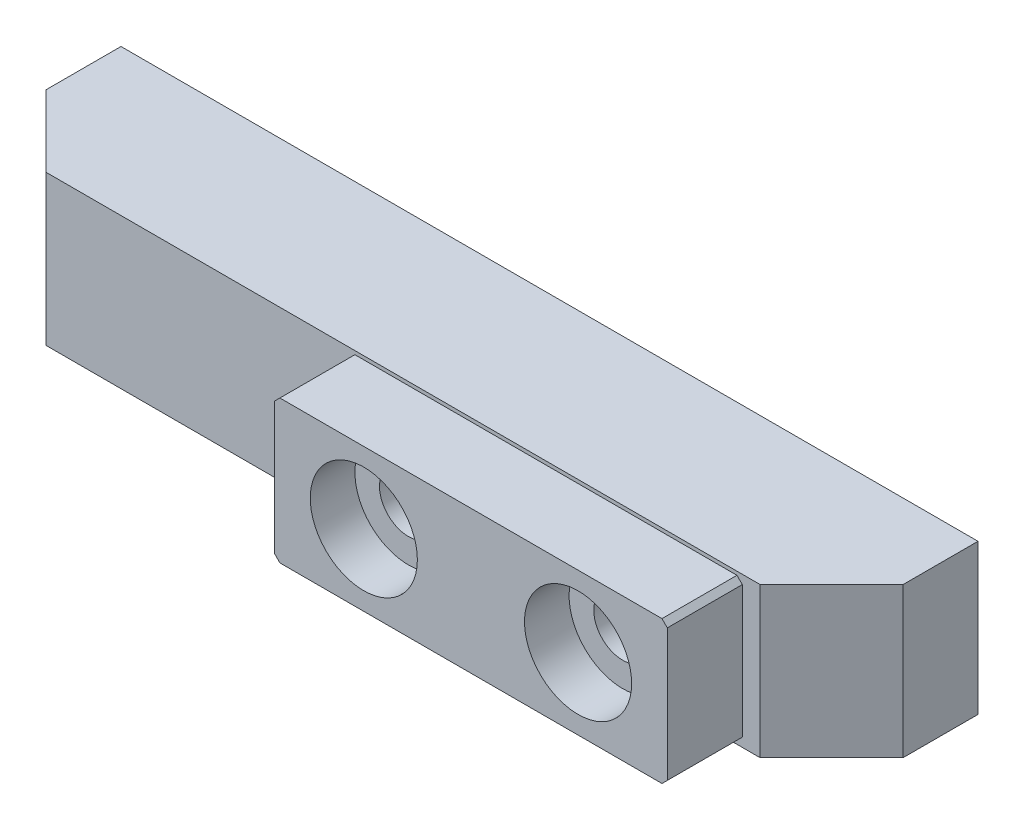
ISO-10303-21;
HEADER;
FILE_DESCRIPTION(('STEP AP214'),'2;1');
FILE_NAME('part.step','',(''),(''),'','','');
FILE_SCHEMA(('AUTOMOTIVE_DESIGN { 1 0 10303 214 1 1 1 1 }'));
ENDSEC;
DATA;
#1=APPLICATION_CONTEXT('core data for automotive mechanical design processes');
#2=APPLICATION_PROTOCOL_DEFINITION('international standard','automotive_design',2000,#1);
#3=PRODUCT_CONTEXT('',#1,'mechanical');
#4=PRODUCT('Part','Part','',(#3));
#5=PRODUCT_RELATED_PRODUCT_CATEGORY('part','',(#4));
#6=PRODUCT_DEFINITION_FORMATION('','',#4);
#7=PRODUCT_DEFINITION_CONTEXT('part definition',#1,'design');
#8=PRODUCT_DEFINITION('design','',#6,#7);
#9=PRODUCT_DEFINITION_SHAPE('','',#8);
#10=(LENGTH_UNIT() NAMED_UNIT(*) SI_UNIT(.MILLI.,.METRE.));
#11=(NAMED_UNIT(*) PLANE_ANGLE_UNIT() SI_UNIT($,.RADIAN.));
#12=(NAMED_UNIT(*) SI_UNIT($,.STERADIAN.) SOLID_ANGLE_UNIT());
#13=UNCERTAINTY_MEASURE_WITH_UNIT(LENGTH_MEASURE(1.E-05),#10,'distance_accuracy_value','');
#14=(GEOMETRIC_REPRESENTATION_CONTEXT(3) GLOBAL_UNCERTAINTY_ASSIGNED_CONTEXT((#13)) GLOBAL_UNIT_ASSIGNED_CONTEXT((#10,
#11,#12)) REPRESENTATION_CONTEXT('',''));
#15=CARTESIAN_POINT('',(0.,0.,0.));
#16=DIRECTION('',(0.,0.,1.));
#17=DIRECTION('',(1.,0.,0.));
#18=AXIS2_PLACEMENT_3D('',#15,#16,#17);
#19=CARTESIAN_POINT('',(3.,0.,0.));
#20=DIRECTION('',(0.,0.,1.));
#21=DIRECTION('',(1.,0.,0.));
#22=AXIS2_PLACEMENT_3D('',#19,#20,#21);
#23=PLANE('',#22);
#24=DIRECTION('',(-1.,0.,0.));
#25=VECTOR('',#24,1.);
#26=CARTESIAN_POINT('',(27.,4.2,0.));
#27=LINE('',#26,#25);
#28=CARTESIAN_POINT('',(27.,4.2,0.));
#29=VERTEX_POINT('',#28);
#30=CARTESIAN_POINT('',(-21.,4.2,0.));
#31=VERTEX_POINT('',#30);
#32=EDGE_CURVE('E295',#29,#31,#27,.T.);
#33=ORIENTED_EDGE('',*,*,#32,.F.);
#34=DIRECTION('',(0.,1.,0.));
#35=VECTOR('',#34,1.);
#36=CARTESIAN_POINT('',(27.,-4.2,0.));
#37=LINE('',#36,#35);
#38=CARTESIAN_POINT('',(27.,-4.2,0.));
#39=VERTEX_POINT('',#38);
#40=EDGE_CURVE('E240',#39,#29,#37,.T.);
#41=ORIENTED_EDGE('',*,*,#40,.F.);
#42=DIRECTION('',(1.,0.,0.));
#43=VECTOR('',#42,1.);
#44=CARTESIAN_POINT('',(-21.,-4.2,0.));
#45=LINE('',#44,#43);
#46=CARTESIAN_POINT('',(-21.,-4.2,0.));
#47=VERTEX_POINT('',#46);
#48=EDGE_CURVE('E233',#47,#39,#45,.T.);
#49=ORIENTED_EDGE('',*,*,#48,.F.);
#50=DIRECTION('',(0.,-1.,0.));
#51=VECTOR('',#50,1.);
#52=CARTESIAN_POINT('',(-21.,4.2,0.));
#53=LINE('',#52,#51);
#54=EDGE_CURVE('E11',#31,#47,#53,.T.);
#55=ORIENTED_EDGE('',*,*,#54,.F.);
#56=EDGE_LOOP('',(#33,#41,#49,#55));
#57=FACE_BOUND('',#56,.T.);
#58=ADVANCED_FACE('F16',(#57),#23,.F.);
#59=CARTESIAN_POINT('',(-21.,-4.2,0.));
#60=DIRECTION('',(-1.,0.,0.));
#61=DIRECTION('',(0.,0.,1.));
#62=AXIS2_PLACEMENT_3D('',#59,#60,#61);
#63=PLANE('',#62);
#64=DIRECTION('',(0.,-1.,0.));
#65=VECTOR('',#64,1.);
#66=CARTESIAN_POINT('',(-21.,4.2,4.2));
#67=LINE('',#66,#65);
#68=CARTESIAN_POINT('',(-21.,4.2,4.2));
#69=VERTEX_POINT('',#68);
#70=CARTESIAN_POINT('',(-21.,-4.2,4.2));
#71=VERTEX_POINT('',#70);
#72=EDGE_CURVE('E260',#69,#71,#67,.T.);
#73=ORIENTED_EDGE('',*,*,#72,.F.);
#74=DIRECTION('',(0.,0.,1.));
#75=VECTOR('',#74,1.);
#76=CARTESIAN_POINT('',(-21.,4.2,0.));
#77=LINE('',#76,#75);
#78=EDGE_CURVE('E244',#31,#69,#77,.T.);
#79=ORIENTED_EDGE('',*,*,#78,.F.);
#80=ORIENTED_EDGE('',*,*,#54,.T.);
#81=DIRECTION('',(0.,0.,1.));
#82=VECTOR('',#81,1.);
#83=CARTESIAN_POINT('',(-21.,-4.2,0.));
#84=LINE('',#83,#82);
#85=EDGE_CURVE('E227',#47,#71,#84,.T.);
#86=ORIENTED_EDGE('',*,*,#85,.T.);
#87=EDGE_LOOP('',(#73,#79,#80,#86));
#88=FACE_BOUND('',#87,.T.);
#89=ADVANCED_FACE('F449',(#88),#63,.T.);
#90=CARTESIAN_POINT('',(0.,4.,8.2));
#91=DIRECTION('',(0.,1.,0.));
#92=DIRECTION('',(1.,0.,0.));
#93=AXIS2_PLACEMENT_3D('',#90,#91,#92);
#94=PLANE('',#93);
#95=DIRECTION('',(0.,0.,-1.));
#96=VECTOR('',#95,1.);
#97=CARTESIAN_POINT('',(0.3,4.,12.4));
#98=LINE('',#97,#96);
#99=CARTESIAN_POINT('',(0.3,4.,12.4));
#100=VERTEX_POINT('',#99);
#101=CARTESIAN_POINT('',(0.3,4.,8.2));
#102=VERTEX_POINT('',#101);
#103=EDGE_CURVE('E22',#100,#102,#98,.T.);
#104=ORIENTED_EDGE('',*,*,#103,.F.);
#105=DIRECTION('',(1.,0.,0.));
#106=VECTOR('',#105,1.);
#107=CARTESIAN_POINT('',(0.3,4.,12.4));
#108=LINE('',#107,#106);
#109=CARTESIAN_POINT('',(21.7,4.,12.4));
#110=VERTEX_POINT('',#109);
#111=EDGE_CURVE('E297',#100,#110,#108,.T.);
#112=ORIENTED_EDGE('',*,*,#111,.T.);
#113=DIRECTION('',(0.,0.,1.));
#114=VECTOR('',#113,1.);
#115=CARTESIAN_POINT('',(21.7,4.,8.2));
#116=LINE('',#115,#114);
#117=CARTESIAN_POINT('',(21.7,4.,8.2));
#118=VERTEX_POINT('',#117);
#119=EDGE_CURVE('E263',#118,#110,#116,.T.);
#120=ORIENTED_EDGE('',*,*,#119,.F.);
#121=DIRECTION('',(1.,0.,0.));
#122=VECTOR('',#121,1.);
#123=CARTESIAN_POINT('',(0.3,4.,8.2));
#124=LINE('',#123,#122);
#125=EDGE_CURVE('E197',#102,#118,#124,.T.);
#126=ORIENTED_EDGE('',*,*,#125,.F.);
#127=EDGE_LOOP('',(#104,#112,#120,#126));
#128=FACE_BOUND('',#127,.T.);
#129=ADVANCED_FACE('F443',(#128),#94,.T.);
#130=CARTESIAN_POINT('',(22.,-4.,8.2));
#131=DIRECTION('',(0.,-1.,0.));
#132=DIRECTION('',(0.,0.,-1.));
#133=AXIS2_PLACEMENT_3D('',#130,#131,#132);
#134=PLANE('',#133);
#135=DIRECTION('',(0.,0.,1.));
#136=VECTOR('',#135,1.);
#137=CARTESIAN_POINT('',(0.3,-4.,8.2));
#138=LINE('',#137,#136);
#139=CARTESIAN_POINT('',(0.3,-4.,8.2));
#140=VERTEX_POINT('',#139);
#141=CARTESIAN_POINT('',(0.3,-4.,12.4));
#142=VERTEX_POINT('',#141);
#143=EDGE_CURVE('E264',#140,#142,#138,.T.);
#144=ORIENTED_EDGE('',*,*,#143,.F.);
#145=DIRECTION('',(-1.,0.,0.));
#146=VECTOR('',#145,1.);
#147=CARTESIAN_POINT('',(21.7,-4.,8.2));
#148=LINE('',#147,#146);
#149=CARTESIAN_POINT('',(21.7,-4.,8.2));
#150=VERTEX_POINT('',#149);
#151=EDGE_CURVE('E217',#150,#140,#148,.T.);
#152=ORIENTED_EDGE('',*,*,#151,.F.);
#153=DIRECTION('',(0.,0.,-1.));
#154=VECTOR('',#153,1.);
#155=CARTESIAN_POINT('',(21.7,-4.,12.4));
#156=LINE('',#155,#154);
#157=CARTESIAN_POINT('',(21.7,-4.,12.4));
#158=VERTEX_POINT('',#157);
#159=EDGE_CURVE('E191',#158,#150,#156,.T.);
#160=ORIENTED_EDGE('',*,*,#159,.F.);
#161=DIRECTION('',(-1.,0.,0.));
#162=VECTOR('',#161,1.);
#163=CARTESIAN_POINT('',(21.7,-4.,12.4));
#164=LINE('',#163,#162);
#165=EDGE_CURVE('E318',#158,#142,#164,.T.);
#166=ORIENTED_EDGE('',*,*,#165,.T.);
#167=EDGE_LOOP('',(#144,#152,#160,#166));
#168=FACE_BOUND('',#167,.T.);
#169=ADVANCED_FACE('F448',(#168),#134,.T.);
#170=CARTESIAN_POINT('',(3.379,1.621,4.9));
#171=CARTESIAN_POINT('',(3.379,-1.621,4.9));
#172=CARTESIAN_POINT('',(6.621,1.621,4.9));
#173=CARTESIAN_POINT('',(6.621,-1.621,4.9));
#174=(BOUNDED_SURFACE() B_SPLINE_SURFACE(1,1,((#170,#171),(#172,#173)),.UNSPECIFIED.,.F.,.F.,
.F.) B_SPLINE_SURFACE_WITH_KNOTS((2,2),(2,2),(0.,3.242),(0.,3.242),
.UNSPECIFIED.) GEOMETRIC_REPRESENTATION_ITEM() RATIONAL_B_SPLINE_SURFACE(((1.,1.),(1.,1.))) REPRESENTATION_ITEM('') SURFACE());
#175=CARTESIAN_POINT('',(5.,0.,4.9));
#176=DIRECTION('',(0.,0.,1.));
#177=DIRECTION('',(1.,0.,0.));
#178=AXIS2_PLACEMENT_3D('',#175,#176,#177);
#179=CIRCLE('',#178,1.621);
#180=CARTESIAN_POINT('',(6.621,0.,4.9));
#181=VERTEX_POINT('',#180);
#182=EDGE_CURVE('E29',#181,#181,#179,.T.);
#183=ORIENTED_EDGE('',*,*,#182,.T.);
#184=EDGE_LOOP('',(#183));
#185=FACE_BOUND('',#184,.T.);
#186=ADVANCED_FACE('F18',(#185),#174,.F.);
#187=CARTESIAN_POINT('',(3.379,0.,9.9));
#188=CARTESIAN_POINT('',(3.379,-1.621,9.90000000000001));
#189=CARTESIAN_POINT('',(5.,-1.621,9.9));
#190=CARTESIAN_POINT('',(6.62099999999999,-1.621,9.90000000000001));
#191=CARTESIAN_POINT('',(6.621,0.,9.9));
#192=CARTESIAN_POINT('',(6.62099999999999,1.621,9.90000000000001));
#193=CARTESIAN_POINT('',(5.,1.621,9.9));
#194=CARTESIAN_POINT('',(3.379,1.621,9.90000000000001));
#195=CARTESIAN_POINT('',(3.379,0.,9.9));
#196=CARTESIAN_POINT('',(3.379,0.,4.9));
#197=CARTESIAN_POINT('',(3.379,-1.621,4.9));
#198=CARTESIAN_POINT('',(5.,-1.621,4.9));
#199=CARTESIAN_POINT('',(6.62099999999999,-1.621,4.9));
#200=CARTESIAN_POINT('',(6.621,0.,4.9));
#201=CARTESIAN_POINT('',(6.62099999999999,1.621,4.9));
#202=CARTESIAN_POINT('',(5.,1.621,4.9));
#203=CARTESIAN_POINT('',(3.379,1.621,4.9));
#204=CARTESIAN_POINT('',(3.379,0.,4.9));
#205=(BOUNDED_SURFACE() B_SPLINE_SURFACE(1,2,((#187,#188,#189,#190,#191,#192,#193,#194,#195),
(#196,#197,#198,#199,#200,#201,#202,#203,#204)),.UNSPECIFIED.,.F.,.T.,
.F.) B_SPLINE_SURFACE_WITH_KNOTS((2,2),(3,2,2,2,3),(-0.771128932757557,2.31338679827267),(0.,
2.54626084573453,5.09252169146906,7.63878253720358,10.1850433829381),
.UNSPECIFIED.) GEOMETRIC_REPRESENTATION_ITEM() RATIONAL_B_SPLINE_SURFACE(((1.,0.707106781186548,
1.,0.707106781186548,1.,0.707106781186548,1.,0.707106781186548,1.),(1.,0.707106781186548,1.,
0.707106781186548,1.,0.707106781186548,1.,0.707106781186548,1.))) REPRESENTATION_ITEM('') SURFACE());
#206=CARTESIAN_POINT('',(5.,0.,9.9));
#207=DIRECTION('',(0.,0.,1.));
#208=DIRECTION('',(1.,0.,0.));
#209=AXIS2_PLACEMENT_3D('',#206,#207,#208);
#210=CIRCLE('',#209,1.621);
#211=CARTESIAN_POINT('',(3.379,0.,9.9));
#212=VERTEX_POINT('',#211);
#213=EDGE_CURVE('E218',#212,#212,#210,.T.);
#214=ORIENTED_EDGE('',*,*,#182,.F.);
#215=EDGE_LOOP('',(#214));
#216=FACE_BOUND('',#215,.T.);
#217=ORIENTED_EDGE('',*,*,#213,.T.);
#218=EDGE_LOOP('',(#217));
#219=FACE_BOUND('',#218,.T.);
#220=ADVANCED_FACE('F513',(#216,#219),#205,.F.);
#221=CARTESIAN_POINT('',(2.,0.,12.4));
#222=CARTESIAN_POINT('',(2.,-3.,12.4));
#223=CARTESIAN_POINT('',(5.,-3.,12.4));
#224=CARTESIAN_POINT('',(7.99999999999999,-3.,12.4));
#225=CARTESIAN_POINT('',(8.,0.,12.4));
#226=CARTESIAN_POINT('',(7.99999999999999,3.,12.4));
#227=CARTESIAN_POINT('',(5.,3.,12.4));
#228=CARTESIAN_POINT('',(2.,3.,12.4));
#229=CARTESIAN_POINT('',(2.,0.,12.4));
#230=CARTESIAN_POINT('',(2.,0.,9.9));
#231=CARTESIAN_POINT('',(2.,-3.,9.90000000000001));
#232=CARTESIAN_POINT('',(5.,-3.,9.9));
#233=CARTESIAN_POINT('',(7.99999999999999,-3.,9.90000000000001));
#234=CARTESIAN_POINT('',(8.,0.,9.9));
#235=CARTESIAN_POINT('',(7.99999999999999,3.,9.90000000000001));
#236=CARTESIAN_POINT('',(5.,3.,9.9));
#237=CARTESIAN_POINT('',(2.,3.,9.90000000000001));
#238=CARTESIAN_POINT('',(2.,0.,9.9));
#239=(BOUNDED_SURFACE() B_SPLINE_SURFACE(1,2,((#221,#222,#223,#224,#225,#226,#227,#228,#229),
(#230,#231,#232,#233,#234,#235,#236,#237,#238)),.UNSPECIFIED.,.F.,.T.,
.F.) B_SPLINE_SURFACE_WITH_KNOTS((2,2),(3,2,2,2,3),(-0.416666666666667,0.416666666666667),(0.,
4.71238898038469,9.42477796076938,14.1371669411541,18.8495559215388),
.UNSPECIFIED.) GEOMETRIC_REPRESENTATION_ITEM() RATIONAL_B_SPLINE_SURFACE(((1.,0.707106781186548,
1.,0.707106781186548,1.,0.707106781186548,1.,0.707106781186548,1.),(1.,0.707106781186548,1.,
0.707106781186548,1.,0.707106781186548,1.,0.707106781186548,1.))) REPRESENTATION_ITEM('') SURFACE());
#240=CARTESIAN_POINT('',(5.,0.,9.9));
#241=DIRECTION('',(0.,0.,1.));
#242=DIRECTION('',(1.,0.,0.));
#243=AXIS2_PLACEMENT_3D('',#240,#241,#242);
#244=CIRCLE('',#243,3.);
#245=CARTESIAN_POINT('',(8.,0.,9.9));
#246=VERTEX_POINT('',#245);
#247=EDGE_CURVE('E189',#246,#246,#244,.T.);
#248=CARTESIAN_POINT('',(5.,0.,12.4));
#249=DIRECTION('',(0.,0.,-1.));
#250=DIRECTION('',(1.,0.,0.));
#251=AXIS2_PLACEMENT_3D('',#248,#249,#250);
#252=CIRCLE('',#251,3.);
#253=CARTESIAN_POINT('',(8.,0.,12.4));
#254=VERTEX_POINT('',#253);
#255=EDGE_CURVE('E276',#254,#254,#252,.T.);
#256=ORIENTED_EDGE('',*,*,#247,.F.);
#257=EDGE_LOOP('',(#256));
#258=FACE_BOUND('',#257,.T.);
#259=ORIENTED_EDGE('',*,*,#255,.F.);
#260=EDGE_LOOP('',(#259));
#261=FACE_BOUND('',#260,.T.);
#262=ADVANCED_FACE('F436',(#258,#261),#239,.F.);
#263=CARTESIAN_POINT('',(2.,3.,9.9));
#264=CARTESIAN_POINT('',(2.,-3.,9.9));
#265=CARTESIAN_POINT('',(8.,3.,9.9));
#266=CARTESIAN_POINT('',(8.,-3.,9.9));
#267=(BOUNDED_SURFACE() B_SPLINE_SURFACE(1,1,((#263,#264),(#265,#266)),.UNSPECIFIED.,.F.,.F.,
.F.) B_SPLINE_SURFACE_WITH_KNOTS((2,2),(2,2),(0.,6.),(0.,6.),
.UNSPECIFIED.) GEOMETRIC_REPRESENTATION_ITEM() RATIONAL_B_SPLINE_SURFACE(((1.,1.),(1.,1.))) REPRESENTATION_ITEM('') SURFACE());
#268=ORIENTED_EDGE('',*,*,#213,.F.);
#269=EDGE_LOOP('',(#268));
#270=FACE_BOUND('',#269,.T.);
#271=ORIENTED_EDGE('',*,*,#247,.T.);
#272=EDGE_LOOP('',(#271));
#273=FACE_BOUND('',#272,.T.);
#274=ADVANCED_FACE('F430',(#270,#273),#267,.F.);
#275=CARTESIAN_POINT('',(15.379,1.621,4.9));
#276=CARTESIAN_POINT('',(15.379,-1.621,4.9));
#277=CARTESIAN_POINT('',(18.621,1.621,4.9));
#278=CARTESIAN_POINT('',(18.621,-1.621,4.9));
#279=(BOUNDED_SURFACE() B_SPLINE_SURFACE(1,1,((#275,#276),(#277,#278)),.UNSPECIFIED.,.F.,.F.,
.F.) B_SPLINE_SURFACE_WITH_KNOTS((2,2),(2,2),(0.,3.242),(0.,3.242),
.UNSPECIFIED.) GEOMETRIC_REPRESENTATION_ITEM() RATIONAL_B_SPLINE_SURFACE(((1.,1.),(1.,1.))) REPRESENTATION_ITEM('') SURFACE());
#280=CARTESIAN_POINT('',(17.,0.,4.9));
#281=DIRECTION('',(0.,0.,1.));
#282=DIRECTION('',(1.,0.,0.));
#283=AXIS2_PLACEMENT_3D('',#280,#281,#282);
#284=CIRCLE('',#283,1.621);
#285=CARTESIAN_POINT('',(18.621,0.,4.9));
#286=VERTEX_POINT('',#285);
#287=EDGE_CURVE('E181',#286,#286,#284,.T.);
#288=ORIENTED_EDGE('',*,*,#287,.T.);
#289=EDGE_LOOP('',(#288));
#290=FACE_BOUND('',#289,.T.);
#291=ADVANCED_FACE('F435',(#290),#279,.F.);
#292=CARTESIAN_POINT('',(15.379,0.,9.9));
#293=CARTESIAN_POINT('',(15.379,-1.621,9.90000000000001));
#294=CARTESIAN_POINT('',(17.,-1.621,9.9));
#295=CARTESIAN_POINT('',(18.621,-1.621,9.90000000000001));
#296=CARTESIAN_POINT('',(18.621,0.,9.9));
#297=CARTESIAN_POINT('',(18.621,1.621,9.90000000000001));
#298=CARTESIAN_POINT('',(17.,1.621,9.9));
#299=CARTESIAN_POINT('',(15.379,1.621,9.90000000000001));
#300=CARTESIAN_POINT('',(15.379,0.,9.9));
#301=CARTESIAN_POINT('',(15.379,0.,4.9));
#302=CARTESIAN_POINT('',(15.379,-1.621,4.9));
#303=CARTESIAN_POINT('',(17.,-1.621,4.9));
#304=CARTESIAN_POINT('',(18.621,-1.621,4.9));
#305=CARTESIAN_POINT('',(18.621,0.,4.9));
#306=CARTESIAN_POINT('',(18.621,1.621,4.9));
#307=CARTESIAN_POINT('',(17.,1.621,4.9));
#308=CARTESIAN_POINT('',(15.379,1.621,4.9));
#309=CARTESIAN_POINT('',(15.379,0.,4.9));
#310=(BOUNDED_SURFACE() B_SPLINE_SURFACE(1,2,((#292,#293,#294,#295,#296,#297,#298,#299,#300),
(#301,#302,#303,#304,#305,#306,#307,#308,#309)),.UNSPECIFIED.,.F.,.T.,
.F.) B_SPLINE_SURFACE_WITH_KNOTS((2,2),(3,2,2,2,3),(-0.771128932757557,2.31338679827267),(0.,
2.54626084573453,5.09252169146906,7.63878253720358,10.1850433829381),
.UNSPECIFIED.) GEOMETRIC_REPRESENTATION_ITEM() RATIONAL_B_SPLINE_SURFACE(((1.,0.707106781186548,
1.,0.707106781186548,1.,0.707106781186548,1.,0.707106781186548,1.),(1.,0.707106781186548,1.,
0.707106781186548,1.,0.707106781186548,1.,0.707106781186548,1.))) REPRESENTATION_ITEM('') SURFACE());
#311=CARTESIAN_POINT('',(17.,0.,9.9));
#312=DIRECTION('',(0.,0.,1.));
#313=DIRECTION('',(1.,0.,0.));
#314=AXIS2_PLACEMENT_3D('',#311,#312,#313);
#315=CIRCLE('',#314,1.621);
#316=CARTESIAN_POINT('',(15.379,0.,9.9));
#317=VERTEX_POINT('',#316);
#318=EDGE_CURVE('E177',#317,#317,#315,.T.);
#319=ORIENTED_EDGE('',*,*,#287,.F.);
#320=EDGE_LOOP('',(#319));
#321=FACE_BOUND('',#320,.T.);
#322=ORIENTED_EDGE('',*,*,#318,.T.);
#323=EDGE_LOOP('',(#322));
#324=FACE_BOUND('',#323,.T.);
#325=ADVANCED_FACE('F178',(#321,#324),#310,.F.);
#326=CARTESIAN_POINT('',(14.,0.,12.4));
#327=CARTESIAN_POINT('',(14.,-3.,12.4));
#328=CARTESIAN_POINT('',(17.,-3.,12.4));
#329=CARTESIAN_POINT('',(20.,-3.,12.4));
#330=CARTESIAN_POINT('',(20.,0.,12.4));
#331=CARTESIAN_POINT('',(20.,3.,12.4));
#332=CARTESIAN_POINT('',(17.,3.,12.4));
#333=CARTESIAN_POINT('',(14.,3.,12.4));
#334=CARTESIAN_POINT('',(14.,0.,12.4));
#335=CARTESIAN_POINT('',(14.,0.,9.9));
#336=CARTESIAN_POINT('',(14.,-3.,9.90000000000001));
#337=CARTESIAN_POINT('',(17.,-3.,9.9));
#338=CARTESIAN_POINT('',(20.,-3.,9.90000000000001));
#339=CARTESIAN_POINT('',(20.,0.,9.9));
#340=CARTESIAN_POINT('',(20.,3.,9.90000000000001));
#341=CARTESIAN_POINT('',(17.,3.,9.9));
#342=CARTESIAN_POINT('',(14.,3.,9.90000000000001));
#343=CARTESIAN_POINT('',(14.,0.,9.9));
#344=(BOUNDED_SURFACE() B_SPLINE_SURFACE(1,2,((#326,#327,#328,#329,#330,#331,#332,#333,#334),
(#335,#336,#337,#338,#339,#340,#341,#342,#343)),.UNSPECIFIED.,.F.,.T.,
.F.) B_SPLINE_SURFACE_WITH_KNOTS((2,2),(3,2,2,2,3),(-0.416666666666667,0.416666666666667),(0.,
4.71238898038469,9.42477796076938,14.1371669411541,18.8495559215388),
.UNSPECIFIED.) GEOMETRIC_REPRESENTATION_ITEM() RATIONAL_B_SPLINE_SURFACE(((1.,0.707106781186548,
1.,0.707106781186548,1.,0.707106781186548,1.,0.707106781186548,1.),(1.,0.707106781186548,1.,
0.707106781186548,1.,0.707106781186548,1.,0.707106781186548,1.))) REPRESENTATION_ITEM('') SURFACE());
#345=CARTESIAN_POINT('',(17.,0.,9.9));
#346=DIRECTION('',(0.,0.,1.));
#347=DIRECTION('',(1.,0.,0.));
#348=AXIS2_PLACEMENT_3D('',#345,#346,#347);
#349=CIRCLE('',#348,3.);
#350=CARTESIAN_POINT('',(20.,0.,9.9));
#351=VERTEX_POINT('',#350);
#352=EDGE_CURVE('E182',#351,#351,#349,.T.);
#353=CARTESIAN_POINT('',(17.,0.,12.4));
#354=DIRECTION('',(0.,0.,-1.));
#355=DIRECTION('',(1.,0.,0.));
#356=AXIS2_PLACEMENT_3D('',#353,#354,#355);
#357=CIRCLE('',#356,3.);
#358=CARTESIAN_POINT('',(20.,0.,12.4));
#359=VERTEX_POINT('',#358);
#360=EDGE_CURVE('E301',#359,#359,#357,.T.);
#361=ORIENTED_EDGE('',*,*,#352,.F.);
#362=EDGE_LOOP('',(#361));
#363=FACE_BOUND('',#362,.T.);
#364=ORIENTED_EDGE('',*,*,#360,.F.);
#365=EDGE_LOOP('',(#364));
#366=FACE_BOUND('',#365,.T.);
#367=ADVANCED_FACE('F602',(#363,#366),#344,.F.);
#368=CARTESIAN_POINT('',(14.,3.,9.9));
#369=CARTESIAN_POINT('',(14.,-3.,9.9));
#370=CARTESIAN_POINT('',(20.,3.,9.9));
#371=CARTESIAN_POINT('',(20.,-3.,9.9));
#372=(BOUNDED_SURFACE() B_SPLINE_SURFACE(1,1,((#368,#369),(#370,#371)),.UNSPECIFIED.,.F.,.F.,
.F.) B_SPLINE_SURFACE_WITH_KNOTS((2,2),(2,2),(0.,6.),(0.,6.),
.UNSPECIFIED.) GEOMETRIC_REPRESENTATION_ITEM() RATIONAL_B_SPLINE_SURFACE(((1.,1.),(1.,1.))) REPRESENTATION_ITEM('') SURFACE());
#373=ORIENTED_EDGE('',*,*,#318,.F.);
#374=EDGE_LOOP('',(#373));
#375=FACE_BOUND('',#374,.T.);
#376=ORIENTED_EDGE('',*,*,#352,.T.);
#377=EDGE_LOOP('',(#376));
#378=FACE_BOUND('',#377,.T.);
#379=ADVANCED_FACE('F585',(#375,#378),#372,.F.);
#380=CARTESIAN_POINT('',(21.85,-3.85,8.2));
#381=DIRECTION('',(0.70710678118655,-0.707106781186545,0.));
#382=DIRECTION('',(0.,0.,-1.));
#383=AXIS2_PLACEMENT_3D('',#380,#381,#382);
#384=PLANE('',#383);
#385=DIRECTION('',(-0.707106781186543,-0.707106781186552,0.));
#386=VECTOR('',#385,1.);
#387=CARTESIAN_POINT('',(22.,-3.7,12.4));
#388=LINE('',#387,#386);
#389=CARTESIAN_POINT('',(22.,-3.7,12.4));
#390=VERTEX_POINT('',#389);
#391=EDGE_CURVE('E195',#390,#158,#388,.T.);
#392=ORIENTED_EDGE('',*,*,#391,.T.);
#393=ORIENTED_EDGE('',*,*,#159,.T.);
#394=DIRECTION('',(0.707106781186544,0.707106781186551,0.));
#395=VECTOR('',#394,1.);
#396=CARTESIAN_POINT('',(22.,-3.7,8.2));
#397=LINE('',#396,#395);
#398=CARTESIAN_POINT('',(22.,-3.7,8.2));
#399=VERTEX_POINT('',#398);
#400=EDGE_CURVE('E212',#150,#399,#397,.T.);
#401=ORIENTED_EDGE('',*,*,#400,.T.);
#402=DIRECTION('',(0.,0.,1.));
#403=VECTOR('',#402,1.);
#404=CARTESIAN_POINT('',(22.,-3.7,8.2));
#405=LINE('',#404,#403);
#406=EDGE_CURVE('E273',#399,#390,#405,.T.);
#407=ORIENTED_EDGE('',*,*,#406,.T.);
#408=EDGE_LOOP('',(#392,#393,#401,#407));
#409=FACE_BOUND('',#408,.T.);
#410=ADVANCED_FACE('F562',(#409),#384,.T.);
#411=CARTESIAN_POINT('',(22.,4.,8.2));
#412=DIRECTION('',(1.,0.,0.));
#413=DIRECTION('',(0.,1.,0.));
#414=AXIS2_PLACEMENT_3D('',#411,#412,#413);
#415=PLANE('',#414);
#416=DIRECTION('',(0.,0.,-1.));
#417=VECTOR('',#416,1.);
#418=CARTESIAN_POINT('',(22.,3.7,12.4));
#419=LINE('',#418,#417);
#420=CARTESIAN_POINT('',(22.,3.7,12.4));
#421=VERTEX_POINT('',#420);
#422=CARTESIAN_POINT('',(22.,3.7,8.2));
#423=VERTEX_POINT('',#422);
#424=EDGE_CURVE('E261',#421,#423,#419,.T.);
#425=ORIENTED_EDGE('',*,*,#424,.F.);
#426=DIRECTION('',(0.,-1.,0.));
#427=VECTOR('',#426,1.);
#428=CARTESIAN_POINT('',(22.,3.7,12.4));
#429=LINE('',#428,#427);
#430=EDGE_CURVE('E331',#421,#390,#429,.T.);
#431=ORIENTED_EDGE('',*,*,#430,.T.);
#432=ORIENTED_EDGE('',*,*,#406,.F.);
#433=DIRECTION('',(0.,-1.,0.));
#434=VECTOR('',#433,1.);
#435=CARTESIAN_POINT('',(22.,3.7,8.2));
#436=LINE('',#435,#434);
#437=EDGE_CURVE('E208',#423,#399,#436,.T.);
#438=ORIENTED_EDGE('',*,*,#437,.F.);
#439=EDGE_LOOP('',(#425,#431,#432,#438));
#440=FACE_BOUND('',#439,.T.);
#441=ADVANCED_FACE('F494',(#440),#415,.T.);
#442=CARTESIAN_POINT('',(21.85,3.85,8.2));
#443=DIRECTION('',(0.70710678118655,0.707106781186545,0.));
#444=DIRECTION('',(0.,0.,-1.));
#445=AXIS2_PLACEMENT_3D('',#442,#443,#444);
#446=PLANE('',#445);
#447=DIRECTION('',(0.707106781186543,-0.707106781186552,0.));
#448=VECTOR('',#447,1.);
#449=CARTESIAN_POINT('',(21.7,4.,12.4));
#450=LINE('',#449,#448);
#451=EDGE_CURVE('E302',#110,#421,#450,.T.);
#452=ORIENTED_EDGE('',*,*,#451,.T.);
#453=ORIENTED_EDGE('',*,*,#424,.T.);
#454=DIRECTION('',(-0.707106781186543,0.707106781186552,0.));
#455=VECTOR('',#454,1.);
#456=CARTESIAN_POINT('',(21.7,4.,8.2));
#457=LINE('',#456,#455);
#458=EDGE_CURVE('E201',#423,#118,#457,.T.);
#459=ORIENTED_EDGE('',*,*,#458,.T.);
#460=ORIENTED_EDGE('',*,*,#119,.T.);
#461=EDGE_LOOP('',(#452,#453,#459,#460));
#462=FACE_BOUND('',#461,.T.);
#463=ADVANCED_FACE('F488',(#462),#446,.T.);
#464=CARTESIAN_POINT('',(0.15,-3.85,8.2));
#465=DIRECTION('',(-0.707106781186546,-0.707106781186549,0.));
#466=DIRECTION('',(-0.707106781186549,0.707106781186546,0.));
#467=AXIS2_PLACEMENT_3D('',#464,#465,#466);
#468=PLANE('',#467);
#469=DIRECTION('',(-0.707106781186549,0.707106781186547,0.));
#470=VECTOR('',#469,1.);
#471=CARTESIAN_POINT('',(0.3,-4.,12.4));
#472=LINE('',#471,#470);
#473=CARTESIAN_POINT('',(0.,-3.7,12.4));
#474=VERTEX_POINT('',#473);
#475=EDGE_CURVE('E269',#142,#474,#472,.T.);
#476=ORIENTED_EDGE('',*,*,#475,.T.);
#477=DIRECTION('',(0.,0.,-1.));
#478=VECTOR('',#477,1.);
#479=CARTESIAN_POINT('',(0.,-3.7,12.4));
#480=LINE('',#479,#478);
#481=CARTESIAN_POINT('',(0.,-3.7,8.2));
#482=VERTEX_POINT('',#481);
#483=EDGE_CURVE('E274',#474,#482,#480,.T.);
#484=ORIENTED_EDGE('',*,*,#483,.T.);
#485=DIRECTION('',(0.707106781186549,-0.707106781186546,0.));
#486=VECTOR('',#485,1.);
#487=CARTESIAN_POINT('',(0.3,-4.,8.2));
#488=LINE('',#487,#486);
#489=EDGE_CURVE('E207',#482,#140,#488,.T.);
#490=ORIENTED_EDGE('',*,*,#489,.T.);
#491=ORIENTED_EDGE('',*,*,#143,.T.);
#492=EDGE_LOOP('',(#476,#484,#490,#491));
#493=FACE_BOUND('',#492,.T.);
#494=ADVANCED_FACE('F493',(#493),#468,.T.);
#495=CARTESIAN_POINT('',(0.,-4.,8.2));
#496=DIRECTION('',(-1.,0.,0.));
#497=DIRECTION('',(0.,0.,1.));
#498=AXIS2_PLACEMENT_3D('',#495,#496,#497);
#499=PLANE('',#498);
#500=DIRECTION('',(0.,0.,1.));
#501=VECTOR('',#500,1.);
#502=CARTESIAN_POINT('',(0.,3.7,8.2));
#503=LINE('',#502,#501);
#504=CARTESIAN_POINT('',(0.,3.7,8.2));
#505=VERTEX_POINT('',#504);
#506=CARTESIAN_POINT('',(0.,3.7,12.4));
#507=VERTEX_POINT('',#506);
#508=EDGE_CURVE('E270',#505,#507,#503,.T.);
#509=ORIENTED_EDGE('',*,*,#508,.F.);
#510=DIRECTION('',(0.,1.,0.));
#511=VECTOR('',#510,1.);
#512=CARTESIAN_POINT('',(0.,-3.7,8.2));
#513=LINE('',#512,#511);
#514=EDGE_CURVE('E203',#482,#505,#513,.T.);
#515=ORIENTED_EDGE('',*,*,#514,.F.);
#516=ORIENTED_EDGE('',*,*,#483,.F.);
#517=DIRECTION('',(0.,1.,0.));
#518=VECTOR('',#517,1.);
#519=CARTESIAN_POINT('',(0.,-3.7,12.4));
#520=LINE('',#519,#518);
#521=EDGE_CURVE('E266',#474,#507,#520,.T.);
#522=ORIENTED_EDGE('',*,*,#521,.T.);
#523=EDGE_LOOP('',(#509,#515,#516,#522));
#524=FACE_BOUND('',#523,.T.);
#525=ADVANCED_FACE('F504',(#524),#499,.T.);
#526=CARTESIAN_POINT('',(11.,0.,12.4));
#527=DIRECTION('',(0.,0.,1.));
#528=DIRECTION('',(1.,0.,0.));
#529=AXIS2_PLACEMENT_3D('',#526,#527,#528);
#530=PLANE('',#529);
#531=ORIENTED_EDGE('',*,*,#255,.T.);
#532=EDGE_LOOP('',(#531));
#533=FACE_BOUND('',#532,.T.);
#534=ORIENTED_EDGE('',*,*,#360,.T.);
#535=EDGE_LOOP('',(#534));
#536=FACE_BOUND('',#535,.T.);
#537=DIRECTION('',(0.707106781186547,0.707106781186548,0.));
#538=VECTOR('',#537,1.);
#539=CARTESIAN_POINT('',(0.,3.7,12.4));
#540=LINE('',#539,#538);
#541=EDGE_CURVE('E243',#507,#100,#540,.T.);
#542=ORIENTED_EDGE('',*,*,#541,.F.);
#543=ORIENTED_EDGE('',*,*,#521,.F.);
#544=ORIENTED_EDGE('',*,*,#475,.F.);
#545=ORIENTED_EDGE('',*,*,#165,.F.);
#546=ORIENTED_EDGE('',*,*,#391,.F.);
#547=ORIENTED_EDGE('',*,*,#430,.F.);
#548=ORIENTED_EDGE('',*,*,#451,.F.);
#549=ORIENTED_EDGE('',*,*,#111,.F.);
#550=EDGE_LOOP('',(#542,#543,#544,#545,#546,#547,#548,#549));
#551=FACE_BOUND('',#550,.T.);
#552=ADVANCED_FACE('F519',(#533,#536,#551),#530,.T.);
#553=CARTESIAN_POINT('',(0.15,3.85,8.2));
#554=DIRECTION('',(-0.707106781186548,0.707106781186547,0.));
#555=DIRECTION('',(0.,0.,1.));
#556=AXIS2_PLACEMENT_3D('',#553,#554,#555);
#557=PLANE('',#556);
#558=ORIENTED_EDGE('',*,*,#541,.T.);
#559=ORIENTED_EDGE('',*,*,#103,.T.);
#560=DIRECTION('',(-0.707106781186547,-0.707106781186548,0.));
#561=VECTOR('',#560,1.);
#562=CARTESIAN_POINT('',(0.,3.7,8.2));
#563=LINE('',#562,#561);
#564=EDGE_CURVE('E202',#102,#505,#563,.T.);
#565=ORIENTED_EDGE('',*,*,#564,.T.);
#566=ORIENTED_EDGE('',*,*,#508,.T.);
#567=EDGE_LOOP('',(#558,#559,#565,#566));
#568=FACE_BOUND('',#567,.T.);
#569=ADVANCED_FACE('F524',(#568),#557,.T.);
#570=CARTESIAN_POINT('',(27.,4.2,0.));
#571=DIRECTION('',(1.,0.,0.));
#572=DIRECTION('',(0.,1.,0.));
#573=AXIS2_PLACEMENT_3D('',#570,#571,#572);
#574=PLANE('',#573);
#575=DIRECTION('',(0.,1.,0.));
#576=VECTOR('',#575,1.);
#577=CARTESIAN_POINT('',(27.,-4.2,4.2));
#578=LINE('',#577,#576);
#579=CARTESIAN_POINT('',(27.,-4.2,4.2));
#580=VERTEX_POINT('',#579);
#581=CARTESIAN_POINT('',(27.,4.2,4.2));
#582=VERTEX_POINT('',#581);
#583=EDGE_CURVE('E245',#580,#582,#578,.T.);
#584=ORIENTED_EDGE('',*,*,#583,.F.);
#585=DIRECTION('',(0.,0.,1.));
#586=VECTOR('',#585,1.);
#587=CARTESIAN_POINT('',(27.,-4.2,0.));
#588=LINE('',#587,#586);
#589=EDGE_CURVE('E228',#39,#580,#588,.T.);
#590=ORIENTED_EDGE('',*,*,#589,.F.);
#591=ORIENTED_EDGE('',*,*,#40,.T.);
#592=DIRECTION('',(0.,0.,1.));
#593=VECTOR('',#592,1.);
#594=CARTESIAN_POINT('',(27.,4.2,0.));
#595=LINE('',#594,#593);
#596=EDGE_CURVE('E790',#29,#582,#595,.T.);
#597=ORIENTED_EDGE('',*,*,#596,.T.);
#598=EDGE_LOOP('',(#584,#590,#591,#597));
#599=FACE_BOUND('',#598,.T.);
#600=ADVANCED_FACE('F483',(#599),#574,.T.);
#601=CARTESIAN_POINT('',(-21.,4.2,0.));
#602=DIRECTION('',(0.,1.,0.));
#603=DIRECTION('',(1.,0.,0.));
#604=AXIS2_PLACEMENT_3D('',#601,#602,#603);
#605=PLANE('',#604);
#606=DIRECTION('',(-0.707106781186547,0.,-0.707106781186548));
#607=VECTOR('',#606,1.);
#608=CARTESIAN_POINT('',(-17.,4.2,8.2));
#609=LINE('',#608,#607);
#610=CARTESIAN_POINT('',(-17.,4.2,8.2));
#611=VERTEX_POINT('',#610);
#612=EDGE_CURVE('E256',#611,#69,#609,.T.);
#613=ORIENTED_EDGE('',*,*,#612,.F.);
#614=DIRECTION('',(1.,0.,0.));
#615=VECTOR('',#614,1.);
#616=CARTESIAN_POINT('',(-17.,4.2,8.2));
#617=LINE('',#616,#615);
#618=CARTESIAN_POINT('',(23.,4.2,8.2));
#619=VERTEX_POINT('',#618);
#620=EDGE_CURVE('E213',#611,#619,#617,.T.);
#621=ORIENTED_EDGE('',*,*,#620,.T.);
#622=DIRECTION('',(-0.707106781186548,0.,0.707106781186548));
#623=VECTOR('',#622,1.);
#624=CARTESIAN_POINT('',(27.,4.2,4.2));
#625=LINE('',#624,#623);
#626=EDGE_CURVE('E249',#582,#619,#625,.T.);
#627=ORIENTED_EDGE('',*,*,#626,.F.);
#628=ORIENTED_EDGE('',*,*,#596,.F.);
#629=ORIENTED_EDGE('',*,*,#32,.T.);
#630=ORIENTED_EDGE('',*,*,#78,.T.);
#631=EDGE_LOOP('',(#613,#621,#627,#628,#629,#630));
#632=FACE_BOUND('',#631,.T.);
#633=ADVANCED_FACE('F475',(#632),#605,.T.);
#634=CARTESIAN_POINT('',(25.,2.1,6.2));
#635=DIRECTION('',(0.707106781186548,0.,0.707106781186547));
#636=DIRECTION('',(0.,-1.,0.));
#637=AXIS2_PLACEMENT_3D('',#634,#635,#636);
#638=PLANE('',#637);
#639=DIRECTION('',(0.707106781186547,0.,-0.707106781186548));
#640=VECTOR('',#639,1.);
#641=CARTESIAN_POINT('',(23.,-4.2,8.2));
#642=LINE('',#641,#640);
#643=CARTESIAN_POINT('',(23.,-4.2,8.2));
#644=VERTEX_POINT('',#643);
#645=EDGE_CURVE('E232',#644,#580,#642,.T.);
#646=ORIENTED_EDGE('',*,*,#645,.T.);
#647=ORIENTED_EDGE('',*,*,#583,.T.);
#648=ORIENTED_EDGE('',*,*,#626,.T.);
#649=DIRECTION('',(0.,-1.,0.));
#650=VECTOR('',#649,1.);
#651=CARTESIAN_POINT('',(23.,4.2,8.2));
#652=LINE('',#651,#650);
#653=EDGE_CURVE('E255',#619,#644,#652,.T.);
#654=ORIENTED_EDGE('',*,*,#653,.T.);
#655=EDGE_LOOP('',(#646,#647,#648,#654));
#656=FACE_BOUND('',#655,.T.);
#657=ADVANCED_FACE('F423',(#656),#638,.T.);
#658=CARTESIAN_POINT('',(27.,-4.2,0.));
#659=DIRECTION('',(0.,-1.,0.));
#660=DIRECTION('',(0.,0.,-1.));
#661=AXIS2_PLACEMENT_3D('',#658,#659,#660);
#662=PLANE('',#661);
#663=DIRECTION('',(0.707106781186548,0.,0.707106781186548));
#664=VECTOR('',#663,1.);
#665=CARTESIAN_POINT('',(-21.,-4.2,4.2));
#666=LINE('',#665,#664);
#667=CARTESIAN_POINT('',(-17.,-4.2,8.2));
#668=VERTEX_POINT('',#667);
#669=EDGE_CURVE('E239',#71,#668,#666,.T.);
#670=ORIENTED_EDGE('',*,*,#669,.F.);
#671=ORIENTED_EDGE('',*,*,#85,.F.);
#672=ORIENTED_EDGE('',*,*,#48,.T.);
#673=ORIENTED_EDGE('',*,*,#589,.T.);
#674=ORIENTED_EDGE('',*,*,#645,.F.);
#675=DIRECTION('',(-1.,0.,0.));
#676=VECTOR('',#675,1.);
#677=CARTESIAN_POINT('',(23.,-4.2,8.2));
#678=LINE('',#677,#676);
#679=EDGE_CURVE('E238',#644,#668,#678,.T.);
#680=ORIENTED_EDGE('',*,*,#679,.T.);
#681=EDGE_LOOP('',(#670,#671,#672,#673,#674,#680));
#682=FACE_BOUND('',#681,.T.);
#683=ADVANCED_FACE('F417',(#682),#662,.T.);
#684=CARTESIAN_POINT('',(3.,0.,8.2));
#685=DIRECTION('',(0.,0.,1.));
#686=DIRECTION('',(1.,0.,0.));
#687=AXIS2_PLACEMENT_3D('',#684,#685,#686);
#688=PLANE('',#687);
#689=ORIENTED_EDGE('',*,*,#437,.T.);
#690=ORIENTED_EDGE('',*,*,#400,.F.);
#691=ORIENTED_EDGE('',*,*,#151,.T.);
#692=ORIENTED_EDGE('',*,*,#489,.F.);
#693=ORIENTED_EDGE('',*,*,#514,.T.);
#694=ORIENTED_EDGE('',*,*,#564,.F.);
#695=ORIENTED_EDGE('',*,*,#125,.T.);
#696=ORIENTED_EDGE('',*,*,#458,.F.);
#697=EDGE_LOOP('',(#689,#690,#691,#692,#693,#694,#695,#696));
#698=FACE_BOUND('',#697,.T.);
#699=DIRECTION('',(0.,1.,0.));
#700=VECTOR('',#699,1.);
#701=CARTESIAN_POINT('',(-17.,-4.2,8.2));
#702=LINE('',#701,#700);
#703=EDGE_CURVE('E234',#668,#611,#702,.T.);
#704=ORIENTED_EDGE('',*,*,#703,.F.);
#705=ORIENTED_EDGE('',*,*,#679,.F.);
#706=ORIENTED_EDGE('',*,*,#653,.F.);
#707=ORIENTED_EDGE('',*,*,#620,.F.);
#708=EDGE_LOOP('',(#704,#705,#706,#707));
#709=FACE_BOUND('',#708,.T.);
#710=ADVANCED_FACE('F422',(#698,#709),#688,.T.);
#711=CARTESIAN_POINT('',(-19.,-2.1,6.2));
#712=DIRECTION('',(-0.707106781186548,0.,0.707106781186547));
#713=DIRECTION('',(0.,1.,0.));
#714=AXIS2_PLACEMENT_3D('',#711,#712,#713);
#715=PLANE('',#714);
#716=ORIENTED_EDGE('',*,*,#612,.T.);
#717=ORIENTED_EDGE('',*,*,#72,.T.);
#718=ORIENTED_EDGE('',*,*,#669,.T.);
#719=ORIENTED_EDGE('',*,*,#703,.T.);
#720=EDGE_LOOP('',(#716,#717,#718,#719));
#721=FACE_BOUND('',#720,.T.);
#722=ADVANCED_FACE('F464',(#721),#715,.T.);
#723=CLOSED_SHELL('',(#58,#89,#129,#169,#186,#220,#262,#274,#291,#325,#367,#379,#410,#441,#463,
#494,#525,#552,#569,#600,#633,#657,#683,#710,#722));
#724=MANIFOLD_SOLID_BREP('B1',#723);
#725=ADVANCED_BREP_SHAPE_REPRESENTATION('',(#18,#724),#14);
#726=SHAPE_DEFINITION_REPRESENTATION(#9,#725);
ENDSEC;
END-ISO-10303-21;
